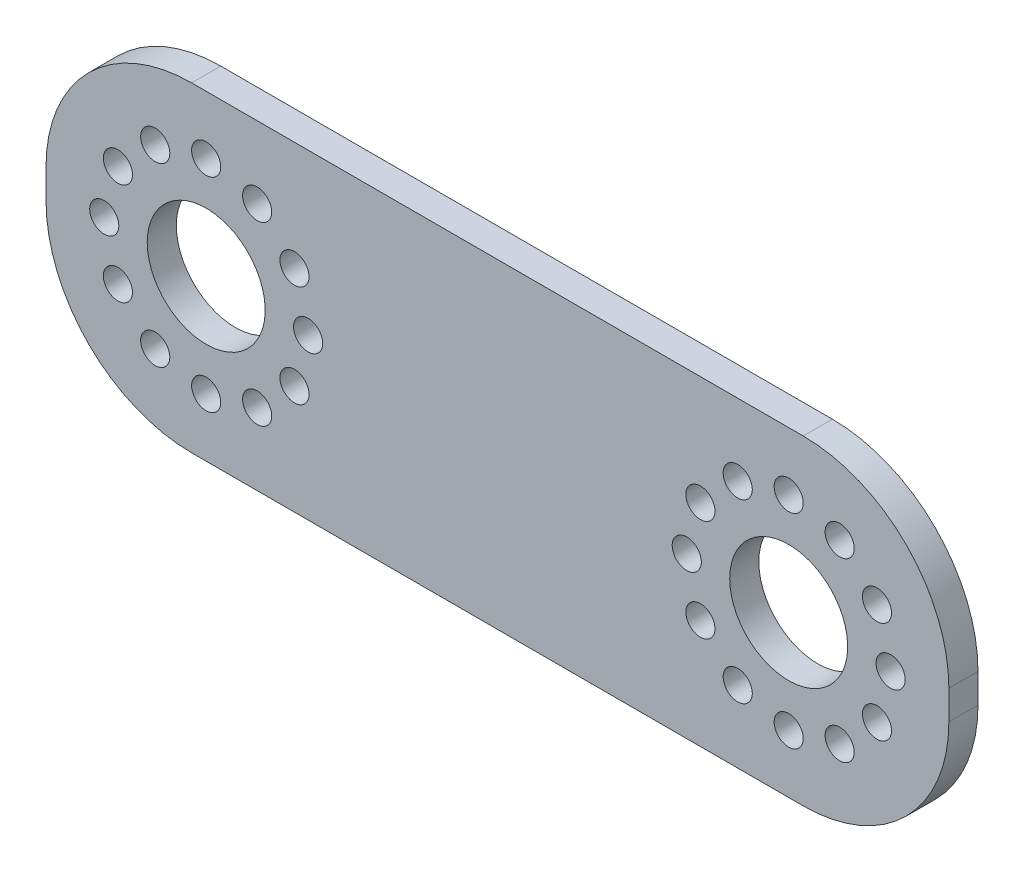
ISO-10303-21;
HEADER;
FILE_DESCRIPTION(('STEP AP214'),'2;1');
FILE_NAME('part.step','',(''),(''),'','','');
FILE_SCHEMA(('AUTOMOTIVE_DESIGN { 1 0 10303 214 1 1 1 1 }'));
ENDSEC;
DATA;
#1=APPLICATION_CONTEXT('core data for automotive mechanical design processes');
#2=APPLICATION_PROTOCOL_DEFINITION('international standard','automotive_design',2000,#1);
#3=PRODUCT_CONTEXT('',#1,'mechanical');
#4=PRODUCT('Part','Part','',(#3));
#5=PRODUCT_RELATED_PRODUCT_CATEGORY('part','',(#4));
#6=PRODUCT_DEFINITION_FORMATION('','',#4);
#7=PRODUCT_DEFINITION_CONTEXT('part definition',#1,'design');
#8=PRODUCT_DEFINITION('design','',#6,#7);
#9=PRODUCT_DEFINITION_SHAPE('','',#8);
#10=(LENGTH_UNIT() NAMED_UNIT(*) SI_UNIT(.MILLI.,.METRE.));
#11=(NAMED_UNIT(*) PLANE_ANGLE_UNIT() SI_UNIT($,.RADIAN.));
#12=(NAMED_UNIT(*) SI_UNIT($,.STERADIAN.) SOLID_ANGLE_UNIT());
#13=UNCERTAINTY_MEASURE_WITH_UNIT(LENGTH_MEASURE(1.E-05),#10,'distance_accuracy_value','');
#14=(GEOMETRIC_REPRESENTATION_CONTEXT(3) GLOBAL_UNCERTAINTY_ASSIGNED_CONTEXT((#13)) GLOBAL_UNIT_ASSIGNED_CONTEXT((#10,
#11,#12)) REPRESENTATION_CONTEXT('',''));
#15=CARTESIAN_POINT('',(0.,0.,0.));
#16=DIRECTION('',(0.,0.,1.));
#17=DIRECTION('',(1.,0.,0.));
#18=AXIS2_PLACEMENT_3D('',#15,#16,#17);
#19=CARTESIAN_POINT('',(62.,11.,2.));
#20=DIRECTION('',(1.,0.,0.));
#21=DIRECTION('',(0.,0.,-1.));
#22=AXIS2_PLACEMENT_3D('',#19,#20,#21);
#23=PLANE('',#22);
#24=DIRECTION('',(0.,-1.,0.));
#25=VECTOR('',#24,1.);
#26=CARTESIAN_POINT('',(62.,11.,0.));
#27=LINE('',#26,#25);
#28=CARTESIAN_POINT('',(62.,0.999999999999999,0.));
#29=VERTEX_POINT('',#28);
#30=CARTESIAN_POINT('',(62.,-0.999999999999999,0.));
#31=VERTEX_POINT('',#30);
#32=EDGE_CURVE('E157',#29,#31,#27,.T.);
#33=ORIENTED_EDGE('',*,*,#32,.F.);
#34=DIRECTION('',(0.,0.,-1.));
#35=VECTOR('',#34,1.);
#36=CARTESIAN_POINT('',(62.,0.999999999999999,2.));
#37=LINE('',#36,#35);
#38=CARTESIAN_POINT('',(62.,0.999999999999999,2.));
#39=VERTEX_POINT('',#38);
#40=EDGE_CURVE('E137',#29,#39,#37,.F.);
#41=ORIENTED_EDGE('',*,*,#40,.T.);
#42=DIRECTION('',(0.,-1.,0.));
#43=VECTOR('',#42,1.);
#44=CARTESIAN_POINT('',(62.,11.,2.));
#45=LINE('',#44,#43);
#46=CARTESIAN_POINT('',(62.,-0.999999999999999,2.));
#47=VERTEX_POINT('',#46);
#48=EDGE_CURVE('E118',#39,#47,#45,.T.);
#49=ORIENTED_EDGE('',*,*,#48,.T.);
#50=DIRECTION('',(0.,0.,-1.));
#51=VECTOR('',#50,1.);
#52=CARTESIAN_POINT('',(62.,-0.999999999999999,2.));
#53=LINE('',#52,#51);
#54=EDGE_CURVE('E134',#47,#31,#53,.T.);
#55=ORIENTED_EDGE('',*,*,#54,.T.);
#56=EDGE_LOOP('',(#33,#41,#49,#55));
#57=FACE_BOUND('',#56,.T.);
#58=ADVANCED_FACE('F32',(#57),#23,.T.);
#59=CARTESIAN_POINT('',(0.,11.,2.));
#60=DIRECTION('',(0.,1.,0.));
#61=DIRECTION('',(-1.,0.,0.));
#62=AXIS2_PLACEMENT_3D('',#59,#60,#61);
#63=PLANE('',#62);
#64=DIRECTION('',(1.,0.,0.));
#65=VECTOR('',#64,1.);
#66=CARTESIAN_POINT('',(0.,11.,2.));
#67=LINE('',#66,#65);
#68=CARTESIAN_POINT('',(10.,11.,2.));
#69=VERTEX_POINT('',#68);
#70=CARTESIAN_POINT('',(52.,11.,2.));
#71=VERTEX_POINT('',#70);
#72=EDGE_CURVE('E122',#69,#71,#67,.T.);
#73=ORIENTED_EDGE('',*,*,#72,.T.);
#74=DIRECTION('',(0.,0.,-1.));
#75=VECTOR('',#74,1.);
#76=CARTESIAN_POINT('',(52.,11.,2.));
#77=LINE('',#76,#75);
#78=CARTESIAN_POINT('',(52.,11.,0.));
#79=VERTEX_POINT('',#78);
#80=EDGE_CURVE('E109',#71,#79,#77,.T.);
#81=ORIENTED_EDGE('',*,*,#80,.T.);
#82=DIRECTION('',(1.,0.,0.));
#83=VECTOR('',#82,1.);
#84=CARTESIAN_POINT('',(0.,11.,0.));
#85=LINE('',#84,#83);
#86=CARTESIAN_POINT('',(10.,11.,0.));
#87=VERTEX_POINT('',#86);
#88=EDGE_CURVE('E101',#87,#79,#85,.T.);
#89=ORIENTED_EDGE('',*,*,#88,.F.);
#90=DIRECTION('',(0.,0.,-1.));
#91=VECTOR('',#90,1.);
#92=CARTESIAN_POINT('',(10.,11.,2.));
#93=LINE('',#92,#91);
#94=EDGE_CURVE('E115',#87,#69,#93,.F.);
#95=ORIENTED_EDGE('',*,*,#94,.T.);
#96=EDGE_LOOP('',(#73,#81,#89,#95));
#97=FACE_BOUND('',#96,.T.);
#98=ADVANCED_FACE('F114',(#97),#63,.T.);
#99=CARTESIAN_POINT('',(0.,-11.,2.));
#100=DIRECTION('',(-1.,0.,0.));
#101=DIRECTION('',(0.,-1.,0.));
#102=AXIS2_PLACEMENT_3D('',#99,#100,#101);
#103=PLANE('',#102);
#104=DIRECTION('',(0.,1.,0.));
#105=VECTOR('',#104,1.);
#106=CARTESIAN_POINT('',(0.,-11.,0.));
#107=LINE('',#106,#105);
#108=CARTESIAN_POINT('',(0.,-0.999999999999996,0.));
#109=VERTEX_POINT('',#108);
#110=CARTESIAN_POINT('',(0.,1.,0.));
#111=VERTEX_POINT('',#110);
#112=EDGE_CURVE('E103',#109,#111,#107,.T.);
#113=ORIENTED_EDGE('',*,*,#112,.F.);
#114=DIRECTION('',(0.,0.,-1.));
#115=VECTOR('',#114,1.);
#116=CARTESIAN_POINT('',(0.,-0.999999999999996,2.));
#117=LINE('',#116,#115);
#118=CARTESIAN_POINT('',(0.,-0.999999999999996,2.));
#119=VERTEX_POINT('',#118);
#120=EDGE_CURVE('E11',#109,#119,#117,.F.);
#121=ORIENTED_EDGE('',*,*,#120,.T.);
#122=DIRECTION('',(0.,1.,0.));
#123=VECTOR('',#122,1.);
#124=CARTESIAN_POINT('',(0.,-11.,2.));
#125=LINE('',#124,#123);
#126=CARTESIAN_POINT('',(0.,1.,2.));
#127=VERTEX_POINT('',#126);
#128=EDGE_CURVE('E125',#119,#127,#125,.T.);
#129=ORIENTED_EDGE('',*,*,#128,.T.);
#130=DIRECTION('',(0.,0.,-1.));
#131=VECTOR('',#130,1.);
#132=CARTESIAN_POINT('',(0.,1.,2.));
#133=LINE('',#132,#131);
#134=EDGE_CURVE('E40',#127,#111,#133,.T.);
#135=ORIENTED_EDGE('',*,*,#134,.T.);
#136=EDGE_LOOP('',(#113,#121,#129,#135));
#137=FACE_BOUND('',#136,.T.);
#138=ADVANCED_FACE('F150',(#137),#103,.T.);
#139=CARTESIAN_POINT('',(62.,-11.,2.));
#140=DIRECTION('',(0.,-1.,0.));
#141=DIRECTION('',(1.,0.,0.));
#142=AXIS2_PLACEMENT_3D('',#139,#140,#141);
#143=PLANE('',#142);
#144=DIRECTION('',(-1.,0.,0.));
#145=VECTOR('',#144,1.);
#146=CARTESIAN_POINT('',(62.,-11.,0.));
#147=LINE('',#146,#145);
#148=CARTESIAN_POINT('',(52.,-11.,0.));
#149=VERTEX_POINT('',#148);
#150=CARTESIAN_POINT('',(10.,-11.,0.));
#151=VERTEX_POINT('',#150);
#152=EDGE_CURVE('E160',#149,#151,#147,.T.);
#153=ORIENTED_EDGE('',*,*,#152,.F.);
#154=DIRECTION('',(0.,0.,-1.));
#155=VECTOR('',#154,1.);
#156=CARTESIAN_POINT('',(52.,-11.,2.));
#157=LINE('',#156,#155);
#158=CARTESIAN_POINT('',(52.,-11.,2.));
#159=VERTEX_POINT('',#158);
#160=EDGE_CURVE('E54',#149,#159,#157,.F.);
#161=ORIENTED_EDGE('',*,*,#160,.T.);
#162=DIRECTION('',(-1.,0.,0.));
#163=VECTOR('',#162,1.);
#164=CARTESIAN_POINT('',(62.,-11.,2.));
#165=LINE('',#164,#163);
#166=CARTESIAN_POINT('',(10.,-11.,2.));
#167=VERTEX_POINT('',#166);
#168=EDGE_CURVE('E152',#159,#167,#165,.T.);
#169=ORIENTED_EDGE('',*,*,#168,.T.);
#170=DIRECTION('',(0.,0.,-1.));
#171=VECTOR('',#170,1.);
#172=CARTESIAN_POINT('',(10.,-11.,2.));
#173=LINE('',#172,#171);
#174=EDGE_CURVE('E145',#167,#151,#173,.T.);
#175=ORIENTED_EDGE('',*,*,#174,.T.);
#176=EDGE_LOOP('',(#153,#161,#169,#175));
#177=FACE_BOUND('',#176,.T.);
#178=ADVANCED_FACE('F163',(#177),#143,.T.);
#179=CARTESIAN_POINT('',(0.,0.,2.));
#180=DIRECTION('',(0.,0.,-1.));
#181=DIRECTION('',(-1.,0.,0.));
#182=AXIS2_PLACEMENT_3D('',#179,#180,#181);
#183=PLANE('',#182);
#184=CARTESIAN_POINT('',(44.9378221735089,3.5,2.));
#185=DIRECTION('',(0.,0.,-1.));
#186=DIRECTION('',(-1.,0.,0.));
#187=AXIS2_PLACEMENT_3D('',#184,#185,#186);
#188=CIRCLE('',#187,1.);
#189=CARTESIAN_POINT('',(43.9378221735089,3.5,2.));
#190=VERTEX_POINT('',#189);
#191=EDGE_CURVE('E324',#190,#190,#188,.T.);
#192=ORIENTED_EDGE('',*,*,#191,.T.);
#193=EDGE_LOOP('',(#192));
#194=FACE_BOUND('',#193,.T.);
#195=CARTESIAN_POINT('',(47.5,6.06217782649107,2.));
#196=DIRECTION('',(0.,0.,-1.));
#197=DIRECTION('',(-1.,0.,0.));
#198=AXIS2_PLACEMENT_3D('',#195,#196,#197);
#199=CIRCLE('',#198,0.999999999999998);
#200=CARTESIAN_POINT('',(46.5,6.06217782649107,2.));
#201=VERTEX_POINT('',#200);
#202=EDGE_CURVE('E318',#201,#201,#199,.T.);
#203=ORIENTED_EDGE('',*,*,#202,.T.);
#204=EDGE_LOOP('',(#203));
#205=FACE_BOUND('',#204,.T.);
#206=CARTESIAN_POINT('',(51.,7.,2.));
#207=DIRECTION('',(0.,0.,-1.));
#208=DIRECTION('',(-1.,0.,0.));
#209=AXIS2_PLACEMENT_3D('',#206,#207,#208);
#210=CIRCLE('',#209,0.999999999999998);
#211=CARTESIAN_POINT('',(50.,7.,2.));
#212=VERTEX_POINT('',#211);
#213=EDGE_CURVE('E312',#212,#212,#210,.T.);
#214=ORIENTED_EDGE('',*,*,#213,.T.);
#215=EDGE_LOOP('',(#214));
#216=FACE_BOUND('',#215,.T.);
#217=CARTESIAN_POINT('',(54.5,6.06217782649107,2.));
#218=DIRECTION('',(0.,0.,-1.));
#219=DIRECTION('',(-1.,0.,0.));
#220=AXIS2_PLACEMENT_3D('',#217,#218,#219);
#221=CIRCLE('',#220,0.999999999999998);
#222=CARTESIAN_POINT('',(53.5,6.06217782649107,2.));
#223=VERTEX_POINT('',#222);
#224=EDGE_CURVE('E306',#223,#223,#221,.T.);
#225=ORIENTED_EDGE('',*,*,#224,.T.);
#226=EDGE_LOOP('',(#225));
#227=FACE_BOUND('',#226,.T.);
#228=CARTESIAN_POINT('',(57.0621778264911,3.5,2.));
#229=DIRECTION('',(0.,0.,-1.));
#230=DIRECTION('',(-1.,0.,0.));
#231=AXIS2_PLACEMENT_3D('',#228,#229,#230);
#232=CIRCLE('',#231,0.999999999999998);
#233=CARTESIAN_POINT('',(56.0621778264911,3.5,2.));
#234=VERTEX_POINT('',#233);
#235=EDGE_CURVE('E300',#234,#234,#232,.T.);
#236=ORIENTED_EDGE('',*,*,#235,.T.);
#237=EDGE_LOOP('',(#236));
#238=FACE_BOUND('',#237,.T.);
#239=CARTESIAN_POINT('',(58.,0.,2.));
#240=DIRECTION('',(0.,0.,-1.));
#241=DIRECTION('',(-1.,0.,0.));
#242=AXIS2_PLACEMENT_3D('',#239,#240,#241);
#243=CIRCLE('',#242,0.999999999999998);
#244=CARTESIAN_POINT('',(57.,0.,2.));
#245=VERTEX_POINT('',#244);
#246=EDGE_CURVE('E294',#245,#245,#243,.T.);
#247=ORIENTED_EDGE('',*,*,#246,.T.);
#248=EDGE_LOOP('',(#247));
#249=FACE_BOUND('',#248,.T.);
#250=CARTESIAN_POINT('',(57.0621778264911,-3.5,2.));
#251=DIRECTION('',(0.,0.,-1.));
#252=DIRECTION('',(-1.,0.,0.));
#253=AXIS2_PLACEMENT_3D('',#250,#251,#252);
#254=CIRCLE('',#253,1.);
#255=CARTESIAN_POINT('',(56.0621778264911,-3.5,2.));
#256=VERTEX_POINT('',#255);
#257=EDGE_CURVE('E288',#256,#256,#254,.T.);
#258=ORIENTED_EDGE('',*,*,#257,.T.);
#259=EDGE_LOOP('',(#258));
#260=FACE_BOUND('',#259,.T.);
#261=CARTESIAN_POINT('',(54.5,-6.06217782649107,2.));
#262=DIRECTION('',(0.,0.,-1.));
#263=DIRECTION('',(-1.,0.,0.));
#264=AXIS2_PLACEMENT_3D('',#261,#262,#263);
#265=CIRCLE('',#264,0.999999999999998);
#266=CARTESIAN_POINT('',(53.5,-6.06217782649107,2.));
#267=VERTEX_POINT('',#266);
#268=EDGE_CURVE('E282',#267,#267,#265,.T.);
#269=ORIENTED_EDGE('',*,*,#268,.T.);
#270=EDGE_LOOP('',(#269));
#271=FACE_BOUND('',#270,.T.);
#272=CARTESIAN_POINT('',(51.,-7.,2.));
#273=DIRECTION('',(0.,0.,-1.));
#274=DIRECTION('',(-1.,0.,0.));
#275=AXIS2_PLACEMENT_3D('',#272,#273,#274);
#276=CIRCLE('',#275,1.00000000000001);
#277=CARTESIAN_POINT('',(50.,-7.,2.));
#278=VERTEX_POINT('',#277);
#279=EDGE_CURVE('E276',#278,#278,#276,.T.);
#280=ORIENTED_EDGE('',*,*,#279,.T.);
#281=EDGE_LOOP('',(#280));
#282=FACE_BOUND('',#281,.T.);
#283=CARTESIAN_POINT('',(47.5,-6.06217782649107,2.));
#284=DIRECTION('',(0.,0.,-1.));
#285=DIRECTION('',(-1.,0.,0.));
#286=AXIS2_PLACEMENT_3D('',#283,#284,#285);
#287=CIRCLE('',#286,0.999999999999998);
#288=CARTESIAN_POINT('',(46.5,-6.06217782649107,2.));
#289=VERTEX_POINT('',#288);
#290=EDGE_CURVE('E270',#289,#289,#287,.T.);
#291=ORIENTED_EDGE('',*,*,#290,.T.);
#292=EDGE_LOOP('',(#291));
#293=FACE_BOUND('',#292,.T.);
#294=CARTESIAN_POINT('',(44.9378221735089,-3.5,2.));
#295=DIRECTION('',(0.,0.,-1.));
#296=DIRECTION('',(-1.,0.,0.));
#297=AXIS2_PLACEMENT_3D('',#294,#295,#296);
#298=CIRCLE('',#297,0.999999999999998);
#299=CARTESIAN_POINT('',(43.9378221735089,-3.5,2.));
#300=VERTEX_POINT('',#299);
#301=EDGE_CURVE('E264',#300,#300,#298,.T.);
#302=ORIENTED_EDGE('',*,*,#301,.T.);
#303=EDGE_LOOP('',(#302));
#304=FACE_BOUND('',#303,.T.);
#305=CARTESIAN_POINT('',(44.,0.,2.));
#306=DIRECTION('',(0.,0.,-1.));
#307=DIRECTION('',(-1.,0.,0.));
#308=AXIS2_PLACEMENT_3D('',#305,#306,#307);
#309=CIRCLE('',#308,1.);
#310=CARTESIAN_POINT('',(43.,0.,2.));
#311=VERTEX_POINT('',#310);
#312=EDGE_CURVE('E258',#311,#311,#309,.T.);
#313=ORIENTED_EDGE('',*,*,#312,.T.);
#314=EDGE_LOOP('',(#313));
#315=FACE_BOUND('',#314,.T.);
#316=CARTESIAN_POINT('',(51.,0.,2.));
#317=DIRECTION('',(0.,0.,-1.));
#318=DIRECTION('',(-1.,0.,0.));
#319=AXIS2_PLACEMENT_3D('',#316,#317,#318);
#320=CIRCLE('',#319,4.05);
#321=CARTESIAN_POINT('',(46.95,0.,2.));
#322=VERTEX_POINT('',#321);
#323=EDGE_CURVE('E252',#322,#322,#320,.T.);
#324=ORIENTED_EDGE('',*,*,#323,.T.);
#325=EDGE_LOOP('',(#324));
#326=FACE_BOUND('',#325,.T.);
#327=CARTESIAN_POINT('',(4.93782217350893,3.5,2.));
#328=DIRECTION('',(0.,0.,-1.));
#329=DIRECTION('',(-1.,0.,0.));
#330=AXIS2_PLACEMENT_3D('',#327,#328,#329);
#331=CIRCLE('',#330,1.);
#332=CARTESIAN_POINT('',(3.93782217350893,3.5,2.));
#333=VERTEX_POINT('',#332);
#334=EDGE_CURVE('E246',#333,#333,#331,.T.);
#335=ORIENTED_EDGE('',*,*,#334,.T.);
#336=EDGE_LOOP('',(#335));
#337=FACE_BOUND('',#336,.T.);
#338=CARTESIAN_POINT('',(7.5,6.06217782649107,2.));
#339=DIRECTION('',(0.,0.,-1.));
#340=DIRECTION('',(-1.,0.,0.));
#341=AXIS2_PLACEMENT_3D('',#338,#339,#340);
#342=CIRCLE('',#341,1.);
#343=CARTESIAN_POINT('',(6.5,6.06217782649107,2.));
#344=VERTEX_POINT('',#343);
#345=EDGE_CURVE('E240',#344,#344,#342,.T.);
#346=ORIENTED_EDGE('',*,*,#345,.T.);
#347=EDGE_LOOP('',(#346));
#348=FACE_BOUND('',#347,.T.);
#349=CARTESIAN_POINT('',(11.,7.,2.));
#350=DIRECTION('',(0.,0.,-1.));
#351=DIRECTION('',(-1.,0.,0.));
#352=AXIS2_PLACEMENT_3D('',#349,#350,#351);
#353=CIRCLE('',#352,1.);
#354=CARTESIAN_POINT('',(10.,7.,2.));
#355=VERTEX_POINT('',#354);
#356=EDGE_CURVE('E234',#355,#355,#353,.T.);
#357=ORIENTED_EDGE('',*,*,#356,.T.);
#358=EDGE_LOOP('',(#357));
#359=FACE_BOUND('',#358,.T.);
#360=CARTESIAN_POINT('',(14.5,6.06217782649107,2.));
#361=DIRECTION('',(0.,0.,-1.));
#362=DIRECTION('',(-1.,0.,0.));
#363=AXIS2_PLACEMENT_3D('',#360,#361,#362);
#364=CIRCLE('',#363,1.);
#365=CARTESIAN_POINT('',(13.5,6.06217782649107,2.));
#366=VERTEX_POINT('',#365);
#367=EDGE_CURVE('E228',#366,#366,#364,.T.);
#368=ORIENTED_EDGE('',*,*,#367,.T.);
#369=EDGE_LOOP('',(#368));
#370=FACE_BOUND('',#369,.T.);
#371=CARTESIAN_POINT('',(17.0621778264911,3.5,2.));
#372=DIRECTION('',(0.,0.,-1.));
#373=DIRECTION('',(-1.,0.,0.));
#374=AXIS2_PLACEMENT_3D('',#371,#372,#373);
#375=CIRCLE('',#374,1.);
#376=CARTESIAN_POINT('',(16.0621778264911,3.5,2.));
#377=VERTEX_POINT('',#376);
#378=EDGE_CURVE('E222',#377,#377,#375,.T.);
#379=ORIENTED_EDGE('',*,*,#378,.T.);
#380=EDGE_LOOP('',(#379));
#381=FACE_BOUND('',#380,.T.);
#382=CARTESIAN_POINT('',(18.,0.,2.));
#383=DIRECTION('',(0.,0.,-1.));
#384=DIRECTION('',(-1.,0.,0.));
#385=AXIS2_PLACEMENT_3D('',#382,#383,#384);
#386=CIRCLE('',#385,0.999999999999998);
#387=CARTESIAN_POINT('',(17.,0.,2.));
#388=VERTEX_POINT('',#387);
#389=EDGE_CURVE('E216',#388,#388,#386,.T.);
#390=ORIENTED_EDGE('',*,*,#389,.T.);
#391=EDGE_LOOP('',(#390));
#392=FACE_BOUND('',#391,.T.);
#393=CARTESIAN_POINT('',(17.0621778264911,-3.5,2.));
#394=DIRECTION('',(0.,0.,-1.));
#395=DIRECTION('',(-1.,0.,0.));
#396=AXIS2_PLACEMENT_3D('',#393,#394,#395);
#397=CIRCLE('',#396,0.999999999999998);
#398=CARTESIAN_POINT('',(16.0621778264911,-3.5,2.));
#399=VERTEX_POINT('',#398);
#400=EDGE_CURVE('E210',#399,#399,#397,.T.);
#401=ORIENTED_EDGE('',*,*,#400,.T.);
#402=EDGE_LOOP('',(#401));
#403=FACE_BOUND('',#402,.T.);
#404=CARTESIAN_POINT('',(14.5,-6.06217782649107,2.));
#405=DIRECTION('',(0.,0.,-1.));
#406=DIRECTION('',(-1.,0.,0.));
#407=AXIS2_PLACEMENT_3D('',#404,#405,#406);
#408=CIRCLE('',#407,1.);
#409=CARTESIAN_POINT('',(13.5,-6.06217782649107,2.));
#410=VERTEX_POINT('',#409);
#411=EDGE_CURVE('E204',#410,#410,#408,.T.);
#412=ORIENTED_EDGE('',*,*,#411,.T.);
#413=EDGE_LOOP('',(#412));
#414=FACE_BOUND('',#413,.T.);
#415=CARTESIAN_POINT('',(11.,-7.,2.));
#416=DIRECTION('',(0.,0.,-1.));
#417=DIRECTION('',(-1.,0.,0.));
#418=AXIS2_PLACEMENT_3D('',#415,#416,#417);
#419=CIRCLE('',#418,1.);
#420=CARTESIAN_POINT('',(10.,-7.,2.));
#421=VERTEX_POINT('',#420);
#422=EDGE_CURVE('E198',#421,#421,#419,.T.);
#423=ORIENTED_EDGE('',*,*,#422,.T.);
#424=EDGE_LOOP('',(#423));
#425=FACE_BOUND('',#424,.T.);
#426=CARTESIAN_POINT('',(7.5,-6.06217782649107,2.));
#427=DIRECTION('',(0.,0.,-1.));
#428=DIRECTION('',(-1.,0.,0.));
#429=AXIS2_PLACEMENT_3D('',#426,#427,#428);
#430=CIRCLE('',#429,1.);
#431=CARTESIAN_POINT('',(6.5,-6.06217782649107,2.));
#432=VERTEX_POINT('',#431);
#433=EDGE_CURVE('E192',#432,#432,#430,.T.);
#434=ORIENTED_EDGE('',*,*,#433,.T.);
#435=EDGE_LOOP('',(#434));
#436=FACE_BOUND('',#435,.T.);
#437=CARTESIAN_POINT('',(4.93782217350893,-3.5,2.));
#438=DIRECTION('',(0.,0.,-1.));
#439=DIRECTION('',(-1.,0.,0.));
#440=AXIS2_PLACEMENT_3D('',#437,#438,#439);
#441=CIRCLE('',#440,1.);
#442=CARTESIAN_POINT('',(3.93782217350893,-3.5,2.));
#443=VERTEX_POINT('',#442);
#444=EDGE_CURVE('E186',#443,#443,#441,.T.);
#445=ORIENTED_EDGE('',*,*,#444,.T.);
#446=EDGE_LOOP('',(#445));
#447=FACE_BOUND('',#446,.T.);
#448=CARTESIAN_POINT('',(4.,0.,2.));
#449=DIRECTION('',(0.,0.,-1.));
#450=DIRECTION('',(-1.,0.,0.));
#451=AXIS2_PLACEMENT_3D('',#448,#449,#450);
#452=CIRCLE('',#451,1.);
#453=CARTESIAN_POINT('',(3.,0.,2.));
#454=VERTEX_POINT('',#453);
#455=EDGE_CURVE('E180',#454,#454,#452,.T.);
#456=ORIENTED_EDGE('',*,*,#455,.T.);
#457=EDGE_LOOP('',(#456));
#458=FACE_BOUND('',#457,.T.);
#459=CARTESIAN_POINT('',(11.,0.,2.));
#460=DIRECTION('',(0.,0.,-1.));
#461=DIRECTION('',(-1.,0.,0.));
#462=AXIS2_PLACEMENT_3D('',#459,#460,#461);
#463=CIRCLE('',#462,4.05);
#464=CARTESIAN_POINT('',(6.95,0.,2.));
#465=VERTEX_POINT('',#464);
#466=EDGE_CURVE('E161',#465,#465,#463,.T.);
#467=ORIENTED_EDGE('',*,*,#466,.T.);
#468=EDGE_LOOP('',(#467));
#469=FACE_BOUND('',#468,.T.);
#470=ORIENTED_EDGE('',*,*,#48,.F.);
#471=CARTESIAN_POINT('',(52.,0.999999999999999,2.));
#472=DIRECTION('',(0.,0.,-1.));
#473=DIRECTION('',(-1.,0.,0.));
#474=AXIS2_PLACEMENT_3D('',#471,#472,#473);
#475=CIRCLE('',#474,10.);
#476=EDGE_CURVE('E143',#39,#71,#475,.F.);
#477=ORIENTED_EDGE('',*,*,#476,.T.);
#478=ORIENTED_EDGE('',*,*,#72,.F.);
#479=CARTESIAN_POINT('',(10.,1.,2.));
#480=DIRECTION('',(0.,0.,-1.));
#481=DIRECTION('',(-1.,0.,0.));
#482=AXIS2_PLACEMENT_3D('',#479,#480,#481);
#483=CIRCLE('',#482,10.);
#484=EDGE_CURVE('E121',#69,#127,#483,.F.);
#485=ORIENTED_EDGE('',*,*,#484,.T.);
#486=ORIENTED_EDGE('',*,*,#128,.F.);
#487=CARTESIAN_POINT('',(10.,-0.999999999999998,2.));
#488=DIRECTION('',(0.,0.,-1.));
#489=DIRECTION('',(-1.,0.,0.));
#490=AXIS2_PLACEMENT_3D('',#487,#488,#489);
#491=CIRCLE('',#490,10.);
#492=EDGE_CURVE('E47',#119,#167,#491,.F.);
#493=ORIENTED_EDGE('',*,*,#492,.T.);
#494=ORIENTED_EDGE('',*,*,#168,.F.);
#495=CARTESIAN_POINT('',(52.,-0.999999999999999,2.));
#496=DIRECTION('',(0.,0.,-1.));
#497=DIRECTION('',(-1.,0.,0.));
#498=AXIS2_PLACEMENT_3D('',#495,#496,#497);
#499=CIRCLE('',#498,10.);
#500=EDGE_CURVE('E141',#159,#47,#499,.F.);
#501=ORIENTED_EDGE('',*,*,#500,.T.);
#502=EDGE_LOOP('',(#470,#477,#478,#485,#486,#493,#494,#501));
#503=FACE_BOUND('',#502,.T.);
#504=ADVANCED_FACE('F171',(#194,#205,#216,#227,#238,#249,#260,#271,#282,#293,#304,#315,#326,
#337,#348,#359,#370,#381,#392,#403,#414,#425,#436,#447,#458,#469,#503),#183,.F.);
#505=CARTESIAN_POINT('',(0.,0.,0.));
#506=DIRECTION('',(0.,0.,-1.));
#507=DIRECTION('',(-1.,0.,0.));
#508=AXIS2_PLACEMENT_3D('',#505,#506,#507);
#509=PLANE('',#508);
#510=CARTESIAN_POINT('',(44.9378221735089,3.5,0.));
#511=DIRECTION('',(0.,0.,-1.));
#512=DIRECTION('',(-1.,0.,0.));
#513=AXIS2_PLACEMENT_3D('',#510,#511,#512);
#514=CIRCLE('',#513,1.);
#515=CARTESIAN_POINT('',(43.9378221735089,3.5,0.));
#516=VERTEX_POINT('',#515);
#517=EDGE_CURVE('E327',#516,#516,#514,.T.);
#518=ORIENTED_EDGE('',*,*,#517,.F.);
#519=EDGE_LOOP('',(#518));
#520=FACE_BOUND('',#519,.T.);
#521=CARTESIAN_POINT('',(47.5,6.06217782649107,0.));
#522=DIRECTION('',(0.,0.,-1.));
#523=DIRECTION('',(-1.,0.,0.));
#524=AXIS2_PLACEMENT_3D('',#521,#522,#523);
#525=CIRCLE('',#524,0.999999999999998);
#526=CARTESIAN_POINT('',(46.5,6.06217782649107,0.));
#527=VERTEX_POINT('',#526);
#528=EDGE_CURVE('E321',#527,#527,#525,.T.);
#529=ORIENTED_EDGE('',*,*,#528,.F.);
#530=EDGE_LOOP('',(#529));
#531=FACE_BOUND('',#530,.T.);
#532=CARTESIAN_POINT('',(51.,7.,0.));
#533=DIRECTION('',(0.,0.,-1.));
#534=DIRECTION('',(-1.,0.,0.));
#535=AXIS2_PLACEMENT_3D('',#532,#533,#534);
#536=CIRCLE('',#535,0.999999999999998);
#537=CARTESIAN_POINT('',(50.,7.,0.));
#538=VERTEX_POINT('',#537);
#539=EDGE_CURVE('E315',#538,#538,#536,.T.);
#540=ORIENTED_EDGE('',*,*,#539,.F.);
#541=EDGE_LOOP('',(#540));
#542=FACE_BOUND('',#541,.T.);
#543=CARTESIAN_POINT('',(54.5,6.06217782649107,0.));
#544=DIRECTION('',(0.,0.,-1.));
#545=DIRECTION('',(-1.,0.,0.));
#546=AXIS2_PLACEMENT_3D('',#543,#544,#545);
#547=CIRCLE('',#546,0.999999999999998);
#548=CARTESIAN_POINT('',(53.5,6.06217782649107,0.));
#549=VERTEX_POINT('',#548);
#550=EDGE_CURVE('E309',#549,#549,#547,.T.);
#551=ORIENTED_EDGE('',*,*,#550,.F.);
#552=EDGE_LOOP('',(#551));
#553=FACE_BOUND('',#552,.T.);
#554=CARTESIAN_POINT('',(57.0621778264911,3.5,0.));
#555=DIRECTION('',(0.,0.,-1.));
#556=DIRECTION('',(-1.,0.,0.));
#557=AXIS2_PLACEMENT_3D('',#554,#555,#556);
#558=CIRCLE('',#557,0.999999999999998);
#559=CARTESIAN_POINT('',(56.0621778264911,3.5,0.));
#560=VERTEX_POINT('',#559);
#561=EDGE_CURVE('E303',#560,#560,#558,.T.);
#562=ORIENTED_EDGE('',*,*,#561,.F.);
#563=EDGE_LOOP('',(#562));
#564=FACE_BOUND('',#563,.T.);
#565=CARTESIAN_POINT('',(58.,0.,0.));
#566=DIRECTION('',(0.,0.,-1.));
#567=DIRECTION('',(-1.,0.,0.));
#568=AXIS2_PLACEMENT_3D('',#565,#566,#567);
#569=CIRCLE('',#568,0.999999999999998);
#570=CARTESIAN_POINT('',(57.,0.,0.));
#571=VERTEX_POINT('',#570);
#572=EDGE_CURVE('E297',#571,#571,#569,.T.);
#573=ORIENTED_EDGE('',*,*,#572,.F.);
#574=EDGE_LOOP('',(#573));
#575=FACE_BOUND('',#574,.T.);
#576=CARTESIAN_POINT('',(57.0621778264911,-3.5,0.));
#577=DIRECTION('',(0.,0.,-1.));
#578=DIRECTION('',(-1.,0.,0.));
#579=AXIS2_PLACEMENT_3D('',#576,#577,#578);
#580=CIRCLE('',#579,1.);
#581=CARTESIAN_POINT('',(56.0621778264911,-3.5,0.));
#582=VERTEX_POINT('',#581);
#583=EDGE_CURVE('E291',#582,#582,#580,.T.);
#584=ORIENTED_EDGE('',*,*,#583,.F.);
#585=EDGE_LOOP('',(#584));
#586=FACE_BOUND('',#585,.T.);
#587=CARTESIAN_POINT('',(54.5,-6.06217782649107,0.));
#588=DIRECTION('',(0.,0.,-1.));
#589=DIRECTION('',(-1.,0.,0.));
#590=AXIS2_PLACEMENT_3D('',#587,#588,#589);
#591=CIRCLE('',#590,0.999999999999998);
#592=CARTESIAN_POINT('',(53.5,-6.06217782649107,0.));
#593=VERTEX_POINT('',#592);
#594=EDGE_CURVE('E285',#593,#593,#591,.T.);
#595=ORIENTED_EDGE('',*,*,#594,.F.);
#596=EDGE_LOOP('',(#595));
#597=FACE_BOUND('',#596,.T.);
#598=CARTESIAN_POINT('',(51.,-7.,0.));
#599=DIRECTION('',(0.,0.,-1.));
#600=DIRECTION('',(-1.,0.,0.));
#601=AXIS2_PLACEMENT_3D('',#598,#599,#600);
#602=CIRCLE('',#601,1.00000000000001);
#603=CARTESIAN_POINT('',(50.,-7.,0.));
#604=VERTEX_POINT('',#603);
#605=EDGE_CURVE('E279',#604,#604,#602,.T.);
#606=ORIENTED_EDGE('',*,*,#605,.F.);
#607=EDGE_LOOP('',(#606));
#608=FACE_BOUND('',#607,.T.);
#609=CARTESIAN_POINT('',(47.5,-6.06217782649107,0.));
#610=DIRECTION('',(0.,0.,-1.));
#611=DIRECTION('',(-1.,0.,0.));
#612=AXIS2_PLACEMENT_3D('',#609,#610,#611);
#613=CIRCLE('',#612,0.999999999999998);
#614=CARTESIAN_POINT('',(46.5,-6.06217782649107,0.));
#615=VERTEX_POINT('',#614);
#616=EDGE_CURVE('E273',#615,#615,#613,.T.);
#617=ORIENTED_EDGE('',*,*,#616,.F.);
#618=EDGE_LOOP('',(#617));
#619=FACE_BOUND('',#618,.T.);
#620=CARTESIAN_POINT('',(44.9378221735089,-3.5,0.));
#621=DIRECTION('',(0.,0.,-1.));
#622=DIRECTION('',(-1.,0.,0.));
#623=AXIS2_PLACEMENT_3D('',#620,#621,#622);
#624=CIRCLE('',#623,0.999999999999998);
#625=CARTESIAN_POINT('',(43.9378221735089,-3.5,0.));
#626=VERTEX_POINT('',#625);
#627=EDGE_CURVE('E267',#626,#626,#624,.T.);
#628=ORIENTED_EDGE('',*,*,#627,.F.);
#629=EDGE_LOOP('',(#628));
#630=FACE_BOUND('',#629,.T.);
#631=CARTESIAN_POINT('',(44.,0.,0.));
#632=DIRECTION('',(0.,0.,-1.));
#633=DIRECTION('',(-1.,0.,0.));
#634=AXIS2_PLACEMENT_3D('',#631,#632,#633);
#635=CIRCLE('',#634,1.);
#636=CARTESIAN_POINT('',(43.,0.,0.));
#637=VERTEX_POINT('',#636);
#638=EDGE_CURVE('E261',#637,#637,#635,.T.);
#639=ORIENTED_EDGE('',*,*,#638,.F.);
#640=EDGE_LOOP('',(#639));
#641=FACE_BOUND('',#640,.T.);
#642=CARTESIAN_POINT('',(51.,0.,0.));
#643=DIRECTION('',(0.,0.,-1.));
#644=DIRECTION('',(-1.,0.,0.));
#645=AXIS2_PLACEMENT_3D('',#642,#643,#644);
#646=CIRCLE('',#645,4.05);
#647=CARTESIAN_POINT('',(46.95,0.,0.));
#648=VERTEX_POINT('',#647);
#649=EDGE_CURVE('E255',#648,#648,#646,.T.);
#650=ORIENTED_EDGE('',*,*,#649,.F.);
#651=EDGE_LOOP('',(#650));
#652=FACE_BOUND('',#651,.T.);
#653=CARTESIAN_POINT('',(4.93782217350893,3.5,0.));
#654=DIRECTION('',(0.,0.,-1.));
#655=DIRECTION('',(-1.,0.,0.));
#656=AXIS2_PLACEMENT_3D('',#653,#654,#655);
#657=CIRCLE('',#656,1.);
#658=CARTESIAN_POINT('',(3.93782217350893,3.5,0.));
#659=VERTEX_POINT('',#658);
#660=EDGE_CURVE('E249',#659,#659,#657,.T.);
#661=ORIENTED_EDGE('',*,*,#660,.F.);
#662=EDGE_LOOP('',(#661));
#663=FACE_BOUND('',#662,.T.);
#664=CARTESIAN_POINT('',(7.5,6.06217782649107,0.));
#665=DIRECTION('',(0.,0.,-1.));
#666=DIRECTION('',(-1.,0.,0.));
#667=AXIS2_PLACEMENT_3D('',#664,#665,#666);
#668=CIRCLE('',#667,1.);
#669=CARTESIAN_POINT('',(6.5,6.06217782649107,0.));
#670=VERTEX_POINT('',#669);
#671=EDGE_CURVE('E243',#670,#670,#668,.T.);
#672=ORIENTED_EDGE('',*,*,#671,.F.);
#673=EDGE_LOOP('',(#672));
#674=FACE_BOUND('',#673,.T.);
#675=CARTESIAN_POINT('',(11.,7.,0.));
#676=DIRECTION('',(0.,0.,-1.));
#677=DIRECTION('',(-1.,0.,0.));
#678=AXIS2_PLACEMENT_3D('',#675,#676,#677);
#679=CIRCLE('',#678,1.);
#680=CARTESIAN_POINT('',(10.,7.,0.));
#681=VERTEX_POINT('',#680);
#682=EDGE_CURVE('E237',#681,#681,#679,.T.);
#683=ORIENTED_EDGE('',*,*,#682,.F.);
#684=EDGE_LOOP('',(#683));
#685=FACE_BOUND('',#684,.T.);
#686=CARTESIAN_POINT('',(14.5,6.06217782649107,0.));
#687=DIRECTION('',(0.,0.,-1.));
#688=DIRECTION('',(-1.,0.,0.));
#689=AXIS2_PLACEMENT_3D('',#686,#687,#688);
#690=CIRCLE('',#689,1.);
#691=CARTESIAN_POINT('',(13.5,6.06217782649107,0.));
#692=VERTEX_POINT('',#691);
#693=EDGE_CURVE('E231',#692,#692,#690,.T.);
#694=ORIENTED_EDGE('',*,*,#693,.F.);
#695=EDGE_LOOP('',(#694));
#696=FACE_BOUND('',#695,.T.);
#697=CARTESIAN_POINT('',(17.0621778264911,3.5,0.));
#698=DIRECTION('',(0.,0.,-1.));
#699=DIRECTION('',(-1.,0.,0.));
#700=AXIS2_PLACEMENT_3D('',#697,#698,#699);
#701=CIRCLE('',#700,1.);
#702=CARTESIAN_POINT('',(16.0621778264911,3.5,0.));
#703=VERTEX_POINT('',#702);
#704=EDGE_CURVE('E225',#703,#703,#701,.T.);
#705=ORIENTED_EDGE('',*,*,#704,.F.);
#706=EDGE_LOOP('',(#705));
#707=FACE_BOUND('',#706,.T.);
#708=CARTESIAN_POINT('',(18.,0.,0.));
#709=DIRECTION('',(0.,0.,-1.));
#710=DIRECTION('',(-1.,0.,0.));
#711=AXIS2_PLACEMENT_3D('',#708,#709,#710);
#712=CIRCLE('',#711,0.999999999999998);
#713=CARTESIAN_POINT('',(17.,0.,0.));
#714=VERTEX_POINT('',#713);
#715=EDGE_CURVE('E219',#714,#714,#712,.T.);
#716=ORIENTED_EDGE('',*,*,#715,.F.);
#717=EDGE_LOOP('',(#716));
#718=FACE_BOUND('',#717,.T.);
#719=CARTESIAN_POINT('',(17.0621778264911,-3.5,0.));
#720=DIRECTION('',(0.,0.,-1.));
#721=DIRECTION('',(-1.,0.,0.));
#722=AXIS2_PLACEMENT_3D('',#719,#720,#721);
#723=CIRCLE('',#722,0.999999999999998);
#724=CARTESIAN_POINT('',(16.0621778264911,-3.5,0.));
#725=VERTEX_POINT('',#724);
#726=EDGE_CURVE('E213',#725,#725,#723,.T.);
#727=ORIENTED_EDGE('',*,*,#726,.F.);
#728=EDGE_LOOP('',(#727));
#729=FACE_BOUND('',#728,.T.);
#730=CARTESIAN_POINT('',(14.5,-6.06217782649107,0.));
#731=DIRECTION('',(0.,0.,-1.));
#732=DIRECTION('',(-1.,0.,0.));
#733=AXIS2_PLACEMENT_3D('',#730,#731,#732);
#734=CIRCLE('',#733,1.);
#735=CARTESIAN_POINT('',(13.5,-6.06217782649107,0.));
#736=VERTEX_POINT('',#735);
#737=EDGE_CURVE('E207',#736,#736,#734,.T.);
#738=ORIENTED_EDGE('',*,*,#737,.F.);
#739=EDGE_LOOP('',(#738));
#740=FACE_BOUND('',#739,.T.);
#741=CARTESIAN_POINT('',(11.,-7.,0.));
#742=DIRECTION('',(0.,0.,-1.));
#743=DIRECTION('',(-1.,0.,0.));
#744=AXIS2_PLACEMENT_3D('',#741,#742,#743);
#745=CIRCLE('',#744,1.);
#746=CARTESIAN_POINT('',(10.,-7.,0.));
#747=VERTEX_POINT('',#746);
#748=EDGE_CURVE('E201',#747,#747,#745,.T.);
#749=ORIENTED_EDGE('',*,*,#748,.F.);
#750=EDGE_LOOP('',(#749));
#751=FACE_BOUND('',#750,.T.);
#752=CARTESIAN_POINT('',(7.5,-6.06217782649107,0.));
#753=DIRECTION('',(0.,0.,-1.));
#754=DIRECTION('',(-1.,0.,0.));
#755=AXIS2_PLACEMENT_3D('',#752,#753,#754);
#756=CIRCLE('',#755,1.);
#757=CARTESIAN_POINT('',(6.5,-6.06217782649107,0.));
#758=VERTEX_POINT('',#757);
#759=EDGE_CURVE('E195',#758,#758,#756,.T.);
#760=ORIENTED_EDGE('',*,*,#759,.F.);
#761=EDGE_LOOP('',(#760));
#762=FACE_BOUND('',#761,.T.);
#763=CARTESIAN_POINT('',(4.93782217350893,-3.5,0.));
#764=DIRECTION('',(0.,0.,-1.));
#765=DIRECTION('',(-1.,0.,0.));
#766=AXIS2_PLACEMENT_3D('',#763,#764,#765);
#767=CIRCLE('',#766,1.);
#768=CARTESIAN_POINT('',(3.93782217350893,-3.5,0.));
#769=VERTEX_POINT('',#768);
#770=EDGE_CURVE('E189',#769,#769,#767,.T.);
#771=ORIENTED_EDGE('',*,*,#770,.F.);
#772=EDGE_LOOP('',(#771));
#773=FACE_BOUND('',#772,.T.);
#774=CARTESIAN_POINT('',(4.,0.,0.));
#775=DIRECTION('',(0.,0.,-1.));
#776=DIRECTION('',(-1.,0.,0.));
#777=AXIS2_PLACEMENT_3D('',#774,#775,#776);
#778=CIRCLE('',#777,1.);
#779=CARTESIAN_POINT('',(3.,0.,0.));
#780=VERTEX_POINT('',#779);
#781=EDGE_CURVE('E183',#780,#780,#778,.T.);
#782=ORIENTED_EDGE('',*,*,#781,.F.);
#783=EDGE_LOOP('',(#782));
#784=FACE_BOUND('',#783,.T.);
#785=CARTESIAN_POINT('',(11.,0.,0.));
#786=DIRECTION('',(0.,0.,-1.));
#787=DIRECTION('',(-1.,0.,0.));
#788=AXIS2_PLACEMENT_3D('',#785,#786,#787);
#789=CIRCLE('',#788,4.05);
#790=CARTESIAN_POINT('',(6.95,0.,0.));
#791=VERTEX_POINT('',#790);
#792=EDGE_CURVE('E177',#791,#791,#789,.T.);
#793=ORIENTED_EDGE('',*,*,#792,.F.);
#794=EDGE_LOOP('',(#793));
#795=FACE_BOUND('',#794,.T.);
#796=ORIENTED_EDGE('',*,*,#88,.T.);
#797=CARTESIAN_POINT('',(52.,0.999999999999999,0.));
#798=DIRECTION('',(0.,0.,-1.));
#799=DIRECTION('',(-1.,0.,0.));
#800=AXIS2_PLACEMENT_3D('',#797,#798,#799);
#801=CIRCLE('',#800,10.);
#802=EDGE_CURVE('E132',#79,#29,#801,.T.);
#803=ORIENTED_EDGE('',*,*,#802,.T.);
#804=ORIENTED_EDGE('',*,*,#32,.T.);
#805=CARTESIAN_POINT('',(52.,-0.999999999999999,0.));
#806=DIRECTION('',(0.,0.,-1.));
#807=DIRECTION('',(-1.,0.,0.));
#808=AXIS2_PLACEMENT_3D('',#805,#806,#807);
#809=CIRCLE('',#808,10.);
#810=EDGE_CURVE('E130',#31,#149,#809,.T.);
#811=ORIENTED_EDGE('',*,*,#810,.T.);
#812=ORIENTED_EDGE('',*,*,#152,.T.);
#813=CARTESIAN_POINT('',(10.,-0.999999999999998,0.));
#814=DIRECTION('',(0.,0.,-1.));
#815=DIRECTION('',(-1.,0.,0.));
#816=AXIS2_PLACEMENT_3D('',#813,#814,#815);
#817=CIRCLE('',#816,10.);
#818=EDGE_CURVE('E108',#151,#109,#817,.T.);
#819=ORIENTED_EDGE('',*,*,#818,.T.);
#820=ORIENTED_EDGE('',*,*,#112,.T.);
#821=CARTESIAN_POINT('',(10.,1.,0.));
#822=DIRECTION('',(0.,0.,-1.));
#823=DIRECTION('',(-1.,0.,0.));
#824=AXIS2_PLACEMENT_3D('',#821,#822,#823);
#825=CIRCLE('',#824,10.);
#826=EDGE_CURVE('E98',#111,#87,#825,.T.);
#827=ORIENTED_EDGE('',*,*,#826,.T.);
#828=EDGE_LOOP('',(#796,#803,#804,#811,#812,#819,#820,#827));
#829=FACE_BOUND('',#828,.T.);
#830=ADVANCED_FACE('F100',(#520,#531,#542,#553,#564,#575,#586,#597,#608,#619,#630,#641,#652,
#663,#674,#685,#696,#707,#718,#729,#740,#751,#762,#773,#784,#795,#829),#509,.T.);
#831=CARTESIAN_POINT('',(11.,0.,2.));
#832=DIRECTION('',(0.,0.,-1.));
#833=DIRECTION('',(-1.,0.,0.));
#834=AXIS2_PLACEMENT_3D('',#831,#832,#833);
#835=CYLINDRICAL_SURFACE('',#834,4.05);
#836=ORIENTED_EDGE('',*,*,#466,.F.);
#837=EDGE_LOOP('',(#836));
#838=FACE_BOUND('',#837,.T.);
#839=ORIENTED_EDGE('',*,*,#792,.T.);
#840=EDGE_LOOP('',(#839));
#841=FACE_BOUND('',#840,.T.);
#842=ADVANCED_FACE('F345',(#838,#841),#835,.F.);
#843=CARTESIAN_POINT('',(4.,0.,2.));
#844=DIRECTION('',(0.,0.,-1.));
#845=DIRECTION('',(-1.,0.,0.));
#846=AXIS2_PLACEMENT_3D('',#843,#844,#845);
#847=CYLINDRICAL_SURFACE('',#846,1.);
#848=ORIENTED_EDGE('',*,*,#455,.F.);
#849=EDGE_LOOP('',(#848));
#850=FACE_BOUND('',#849,.T.);
#851=ORIENTED_EDGE('',*,*,#781,.T.);
#852=EDGE_LOOP('',(#851));
#853=FACE_BOUND('',#852,.T.);
#854=ADVANCED_FACE('F398',(#850,#853),#847,.F.);
#855=CARTESIAN_POINT('',(4.93782217350893,-3.5,2.));
#856=DIRECTION('',(0.,0.,-1.));
#857=DIRECTION('',(-1.,0.,0.));
#858=AXIS2_PLACEMENT_3D('',#855,#856,#857);
#859=CYLINDRICAL_SURFACE('',#858,1.);
#860=ORIENTED_EDGE('',*,*,#444,.F.);
#861=EDGE_LOOP('',(#860));
#862=FACE_BOUND('',#861,.T.);
#863=ORIENTED_EDGE('',*,*,#770,.T.);
#864=EDGE_LOOP('',(#863));
#865=FACE_BOUND('',#864,.T.);
#866=ADVANCED_FACE('F404',(#862,#865),#859,.F.);
#867=CARTESIAN_POINT('',(7.5,-6.06217782649107,2.));
#868=DIRECTION('',(0.,0.,-1.));
#869=DIRECTION('',(-1.,0.,0.));
#870=AXIS2_PLACEMENT_3D('',#867,#868,#869);
#871=CYLINDRICAL_SURFACE('',#870,1.);
#872=ORIENTED_EDGE('',*,*,#433,.F.);
#873=EDGE_LOOP('',(#872));
#874=FACE_BOUND('',#873,.T.);
#875=ORIENTED_EDGE('',*,*,#759,.T.);
#876=EDGE_LOOP('',(#875));
#877=FACE_BOUND('',#876,.T.);
#878=ADVANCED_FACE('F699',(#874,#877),#871,.F.);
#879=CARTESIAN_POINT('',(11.,-7.,2.));
#880=DIRECTION('',(0.,0.,-1.));
#881=DIRECTION('',(-1.,0.,0.));
#882=AXIS2_PLACEMENT_3D('',#879,#880,#881);
#883=CYLINDRICAL_SURFACE('',#882,1.);
#884=ORIENTED_EDGE('',*,*,#422,.F.);
#885=EDGE_LOOP('',(#884));
#886=FACE_BOUND('',#885,.T.);
#887=ORIENTED_EDGE('',*,*,#748,.T.);
#888=EDGE_LOOP('',(#887));
#889=FACE_BOUND('',#888,.T.);
#890=ADVANCED_FACE('F689',(#886,#889),#883,.F.);
#891=CARTESIAN_POINT('',(14.5,-6.06217782649107,2.));
#892=DIRECTION('',(0.,0.,-1.));
#893=DIRECTION('',(-1.,0.,0.));
#894=AXIS2_PLACEMENT_3D('',#891,#892,#893);
#895=CYLINDRICAL_SURFACE('',#894,1.);
#896=ORIENTED_EDGE('',*,*,#411,.F.);
#897=EDGE_LOOP('',(#896));
#898=FACE_BOUND('',#897,.T.);
#899=ORIENTED_EDGE('',*,*,#737,.T.);
#900=EDGE_LOOP('',(#899));
#901=FACE_BOUND('',#900,.T.);
#902=ADVANCED_FACE('F679',(#898,#901),#895,.F.);
#903=CARTESIAN_POINT('',(17.0621778264911,-3.5,2.));
#904=DIRECTION('',(0.,0.,-1.));
#905=DIRECTION('',(-1.,0.,0.));
#906=AXIS2_PLACEMENT_3D('',#903,#904,#905);
#907=CYLINDRICAL_SURFACE('',#906,0.999999999999998);
#908=ORIENTED_EDGE('',*,*,#400,.F.);
#909=EDGE_LOOP('',(#908));
#910=FACE_BOUND('',#909,.T.);
#911=ORIENTED_EDGE('',*,*,#726,.T.);
#912=EDGE_LOOP('',(#911));
#913=FACE_BOUND('',#912,.T.);
#914=ADVANCED_FACE('F669',(#910,#913),#907,.F.);
#915=CARTESIAN_POINT('',(18.,0.,2.));
#916=DIRECTION('',(0.,0.,-1.));
#917=DIRECTION('',(-1.,0.,0.));
#918=AXIS2_PLACEMENT_3D('',#915,#916,#917);
#919=CYLINDRICAL_SURFACE('',#918,0.999999999999998);
#920=ORIENTED_EDGE('',*,*,#389,.F.);
#921=EDGE_LOOP('',(#920));
#922=FACE_BOUND('',#921,.T.);
#923=ORIENTED_EDGE('',*,*,#715,.T.);
#924=EDGE_LOOP('',(#923));
#925=FACE_BOUND('',#924,.T.);
#926=ADVANCED_FACE('F659',(#922,#925),#919,.F.);
#927=CARTESIAN_POINT('',(17.0621778264911,3.5,2.));
#928=DIRECTION('',(0.,0.,-1.));
#929=DIRECTION('',(-1.,0.,0.));
#930=AXIS2_PLACEMENT_3D('',#927,#928,#929);
#931=CYLINDRICAL_SURFACE('',#930,1.);
#932=ORIENTED_EDGE('',*,*,#378,.F.);
#933=EDGE_LOOP('',(#932));
#934=FACE_BOUND('',#933,.T.);
#935=ORIENTED_EDGE('',*,*,#704,.T.);
#936=EDGE_LOOP('',(#935));
#937=FACE_BOUND('',#936,.T.);
#938=ADVANCED_FACE('F649',(#934,#937),#931,.F.);
#939=CARTESIAN_POINT('',(14.5,6.06217782649107,2.));
#940=DIRECTION('',(0.,0.,-1.));
#941=DIRECTION('',(-1.,0.,0.));
#942=AXIS2_PLACEMENT_3D('',#939,#940,#941);
#943=CYLINDRICAL_SURFACE('',#942,1.);
#944=ORIENTED_EDGE('',*,*,#367,.F.);
#945=EDGE_LOOP('',(#944));
#946=FACE_BOUND('',#945,.T.);
#947=ORIENTED_EDGE('',*,*,#693,.T.);
#948=EDGE_LOOP('',(#947));
#949=FACE_BOUND('',#948,.T.);
#950=ADVANCED_FACE('F639',(#946,#949),#943,.F.);
#951=CARTESIAN_POINT('',(11.,7.,2.));
#952=DIRECTION('',(0.,0.,-1.));
#953=DIRECTION('',(-1.,0.,0.));
#954=AXIS2_PLACEMENT_3D('',#951,#952,#953);
#955=CYLINDRICAL_SURFACE('',#954,1.);
#956=ORIENTED_EDGE('',*,*,#356,.F.);
#957=EDGE_LOOP('',(#956));
#958=FACE_BOUND('',#957,.T.);
#959=ORIENTED_EDGE('',*,*,#682,.T.);
#960=EDGE_LOOP('',(#959));
#961=FACE_BOUND('',#960,.T.);
#962=ADVANCED_FACE('F629',(#958,#961),#955,.F.);
#963=CARTESIAN_POINT('',(7.5,6.06217782649107,2.));
#964=DIRECTION('',(0.,0.,-1.));
#965=DIRECTION('',(-1.,0.,0.));
#966=AXIS2_PLACEMENT_3D('',#963,#964,#965);
#967=CYLINDRICAL_SURFACE('',#966,1.);
#968=ORIENTED_EDGE('',*,*,#345,.F.);
#969=EDGE_LOOP('',(#968));
#970=FACE_BOUND('',#969,.T.);
#971=ORIENTED_EDGE('',*,*,#671,.T.);
#972=EDGE_LOOP('',(#971));
#973=FACE_BOUND('',#972,.T.);
#974=ADVANCED_FACE('F619',(#970,#973),#967,.F.);
#975=CARTESIAN_POINT('',(4.93782217350893,3.5,2.));
#976=DIRECTION('',(0.,0.,-1.));
#977=DIRECTION('',(-1.,0.,0.));
#978=AXIS2_PLACEMENT_3D('',#975,#976,#977);
#979=CYLINDRICAL_SURFACE('',#978,1.);
#980=ORIENTED_EDGE('',*,*,#334,.F.);
#981=EDGE_LOOP('',(#980));
#982=FACE_BOUND('',#981,.T.);
#983=ORIENTED_EDGE('',*,*,#660,.T.);
#984=EDGE_LOOP('',(#983));
#985=FACE_BOUND('',#984,.T.);
#986=ADVANCED_FACE('F609',(#982,#985),#979,.F.);
#987=CARTESIAN_POINT('',(51.,0.,2.));
#988=DIRECTION('',(0.,0.,-1.));
#989=DIRECTION('',(-1.,0.,0.));
#990=AXIS2_PLACEMENT_3D('',#987,#988,#989);
#991=CYLINDRICAL_SURFACE('',#990,4.05);
#992=ORIENTED_EDGE('',*,*,#323,.F.);
#993=EDGE_LOOP('',(#992));
#994=FACE_BOUND('',#993,.T.);
#995=ORIENTED_EDGE('',*,*,#649,.T.);
#996=EDGE_LOOP('',(#995));
#997=FACE_BOUND('',#996,.T.);
#998=ADVANCED_FACE('F599',(#994,#997),#991,.F.);
#999=CARTESIAN_POINT('',(44.,0.,2.));
#1000=DIRECTION('',(0.,0.,-1.));
#1001=DIRECTION('',(-1.,0.,0.));
#1002=AXIS2_PLACEMENT_3D('',#999,#1000,#1001);
#1003=CYLINDRICAL_SURFACE('',#1002,1.);
#1004=ORIENTED_EDGE('',*,*,#312,.F.);
#1005=EDGE_LOOP('',(#1004));
#1006=FACE_BOUND('',#1005,.T.);
#1007=ORIENTED_EDGE('',*,*,#638,.T.);
#1008=EDGE_LOOP('',(#1007));
#1009=FACE_BOUND('',#1008,.T.);
#1010=ADVANCED_FACE('F589',(#1006,#1009),#1003,.F.);
#1011=CARTESIAN_POINT('',(44.9378221735089,-3.5,2.));
#1012=DIRECTION('',(0.,0.,-1.));
#1013=DIRECTION('',(-1.,0.,0.));
#1014=AXIS2_PLACEMENT_3D('',#1011,#1012,#1013);
#1015=CYLINDRICAL_SURFACE('',#1014,0.999999999999998);
#1016=ORIENTED_EDGE('',*,*,#301,.F.);
#1017=EDGE_LOOP('',(#1016));
#1018=FACE_BOUND('',#1017,.T.);
#1019=ORIENTED_EDGE('',*,*,#627,.T.);
#1020=EDGE_LOOP('',(#1019));
#1021=FACE_BOUND('',#1020,.T.);
#1022=ADVANCED_FACE('F579',(#1018,#1021),#1015,.F.);
#1023=CARTESIAN_POINT('',(47.5,-6.06217782649107,2.));
#1024=DIRECTION('',(0.,0.,-1.));
#1025=DIRECTION('',(-1.,0.,0.));
#1026=AXIS2_PLACEMENT_3D('',#1023,#1024,#1025);
#1027=CYLINDRICAL_SURFACE('',#1026,0.999999999999998);
#1028=ORIENTED_EDGE('',*,*,#290,.F.);
#1029=EDGE_LOOP('',(#1028));
#1030=FACE_BOUND('',#1029,.T.);
#1031=ORIENTED_EDGE('',*,*,#616,.T.);
#1032=EDGE_LOOP('',(#1031));
#1033=FACE_BOUND('',#1032,.T.);
#1034=ADVANCED_FACE('F569',(#1030,#1033),#1027,.F.);
#1035=CARTESIAN_POINT('',(51.,-7.,2.));
#1036=DIRECTION('',(0.,0.,-1.));
#1037=DIRECTION('',(-1.,0.,0.));
#1038=AXIS2_PLACEMENT_3D('',#1035,#1036,#1037);
#1039=CYLINDRICAL_SURFACE('',#1038,1.00000000000001);
#1040=ORIENTED_EDGE('',*,*,#279,.F.);
#1041=EDGE_LOOP('',(#1040));
#1042=FACE_BOUND('',#1041,.T.);
#1043=ORIENTED_EDGE('',*,*,#605,.T.);
#1044=EDGE_LOOP('',(#1043));
#1045=FACE_BOUND('',#1044,.T.);
#1046=ADVANCED_FACE('F559',(#1042,#1045),#1039,.F.);
#1047=CARTESIAN_POINT('',(54.5,-6.06217782649107,2.));
#1048=DIRECTION('',(0.,0.,-1.));
#1049=DIRECTION('',(-1.,0.,0.));
#1050=AXIS2_PLACEMENT_3D('',#1047,#1048,#1049);
#1051=CYLINDRICAL_SURFACE('',#1050,0.999999999999998);
#1052=ORIENTED_EDGE('',*,*,#268,.F.);
#1053=EDGE_LOOP('',(#1052));
#1054=FACE_BOUND('',#1053,.T.);
#1055=ORIENTED_EDGE('',*,*,#594,.T.);
#1056=EDGE_LOOP('',(#1055));
#1057=FACE_BOUND('',#1056,.T.);
#1058=ADVANCED_FACE('F549',(#1054,#1057),#1051,.F.);
#1059=CARTESIAN_POINT('',(57.0621778264911,-3.5,2.));
#1060=DIRECTION('',(0.,0.,-1.));
#1061=DIRECTION('',(-1.,0.,0.));
#1062=AXIS2_PLACEMENT_3D('',#1059,#1060,#1061);
#1063=CYLINDRICAL_SURFACE('',#1062,1.);
#1064=ORIENTED_EDGE('',*,*,#257,.F.);
#1065=EDGE_LOOP('',(#1064));
#1066=FACE_BOUND('',#1065,.T.);
#1067=ORIENTED_EDGE('',*,*,#583,.T.);
#1068=EDGE_LOOP('',(#1067));
#1069=FACE_BOUND('',#1068,.T.);
#1070=ADVANCED_FACE('F539',(#1066,#1069),#1063,.F.);
#1071=CARTESIAN_POINT('',(58.,0.,2.));
#1072=DIRECTION('',(0.,0.,-1.));
#1073=DIRECTION('',(-1.,0.,0.));
#1074=AXIS2_PLACEMENT_3D('',#1071,#1072,#1073);
#1075=CYLINDRICAL_SURFACE('',#1074,0.999999999999998);
#1076=ORIENTED_EDGE('',*,*,#246,.F.);
#1077=EDGE_LOOP('',(#1076));
#1078=FACE_BOUND('',#1077,.T.);
#1079=ORIENTED_EDGE('',*,*,#572,.T.);
#1080=EDGE_LOOP('',(#1079));
#1081=FACE_BOUND('',#1080,.T.);
#1082=ADVANCED_FACE('F529',(#1078,#1081),#1075,.F.);
#1083=CARTESIAN_POINT('',(57.0621778264911,3.5,2.));
#1084=DIRECTION('',(0.,0.,-1.));
#1085=DIRECTION('',(-1.,0.,0.));
#1086=AXIS2_PLACEMENT_3D('',#1083,#1084,#1085);
#1087=CYLINDRICAL_SURFACE('',#1086,0.999999999999998);
#1088=ORIENTED_EDGE('',*,*,#235,.F.);
#1089=EDGE_LOOP('',(#1088));
#1090=FACE_BOUND('',#1089,.T.);
#1091=ORIENTED_EDGE('',*,*,#561,.T.);
#1092=EDGE_LOOP('',(#1091));
#1093=FACE_BOUND('',#1092,.T.);
#1094=ADVANCED_FACE('F519',(#1090,#1093),#1087,.F.);
#1095=CARTESIAN_POINT('',(54.5,6.06217782649107,2.));
#1096=DIRECTION('',(0.,0.,-1.));
#1097=DIRECTION('',(-1.,0.,0.));
#1098=AXIS2_PLACEMENT_3D('',#1095,#1096,#1097);
#1099=CYLINDRICAL_SURFACE('',#1098,0.999999999999998);
#1100=ORIENTED_EDGE('',*,*,#224,.F.);
#1101=EDGE_LOOP('',(#1100));
#1102=FACE_BOUND('',#1101,.T.);
#1103=ORIENTED_EDGE('',*,*,#550,.T.);
#1104=EDGE_LOOP('',(#1103));
#1105=FACE_BOUND('',#1104,.T.);
#1106=ADVANCED_FACE('F509',(#1102,#1105),#1099,.F.);
#1107=CARTESIAN_POINT('',(51.,7.,2.));
#1108=DIRECTION('',(0.,0.,-1.));
#1109=DIRECTION('',(-1.,0.,0.));
#1110=AXIS2_PLACEMENT_3D('',#1107,#1108,#1109);
#1111=CYLINDRICAL_SURFACE('',#1110,0.999999999999998);
#1112=ORIENTED_EDGE('',*,*,#213,.F.);
#1113=EDGE_LOOP('',(#1112));
#1114=FACE_BOUND('',#1113,.T.);
#1115=ORIENTED_EDGE('',*,*,#539,.T.);
#1116=EDGE_LOOP('',(#1115));
#1117=FACE_BOUND('',#1116,.T.);
#1118=ADVANCED_FACE('F499',(#1114,#1117),#1111,.F.);
#1119=CARTESIAN_POINT('',(47.5,6.06217782649107,2.));
#1120=DIRECTION('',(0.,0.,-1.));
#1121=DIRECTION('',(-1.,0.,0.));
#1122=AXIS2_PLACEMENT_3D('',#1119,#1120,#1121);
#1123=CYLINDRICAL_SURFACE('',#1122,0.999999999999998);
#1124=ORIENTED_EDGE('',*,*,#202,.F.);
#1125=EDGE_LOOP('',(#1124));
#1126=FACE_BOUND('',#1125,.T.);
#1127=ORIENTED_EDGE('',*,*,#528,.T.);
#1128=EDGE_LOOP('',(#1127));
#1129=FACE_BOUND('',#1128,.T.);
#1130=ADVANCED_FACE('F339',(#1126,#1129),#1123,.F.);
#1131=CARTESIAN_POINT('',(44.9378221735089,3.5,2.));
#1132=DIRECTION('',(0.,0.,-1.));
#1133=DIRECTION('',(-1.,0.,0.));
#1134=AXIS2_PLACEMENT_3D('',#1131,#1132,#1133);
#1135=CYLINDRICAL_SURFACE('',#1134,1.);
#1136=ORIENTED_EDGE('',*,*,#191,.F.);
#1137=EDGE_LOOP('',(#1136));
#1138=FACE_BOUND('',#1137,.T.);
#1139=ORIENTED_EDGE('',*,*,#517,.T.);
#1140=EDGE_LOOP('',(#1139));
#1141=FACE_BOUND('',#1140,.T.);
#1142=ADVANCED_FACE('F335',(#1138,#1141),#1135,.F.);
#1143=CARTESIAN_POINT('',(52.,0.999999999999999,2.));
#1144=DIRECTION('',(0.,0.,-1.));
#1145=DIRECTION('',(-1.,0.,0.));
#1146=AXIS2_PLACEMENT_3D('',#1143,#1144,#1145);
#1147=CYLINDRICAL_SURFACE('',#1146,10.);
#1148=ORIENTED_EDGE('',*,*,#476,.F.);
#1149=ORIENTED_EDGE('',*,*,#40,.F.);
#1150=ORIENTED_EDGE('',*,*,#802,.F.);
#1151=ORIENTED_EDGE('',*,*,#80,.F.);
#1152=EDGE_LOOP('',(#1148,#1149,#1150,#1151));
#1153=FACE_BOUND('',#1152,.T.);
#1154=ADVANCED_FACE('F338',(#1153),#1147,.T.);
#1155=CARTESIAN_POINT('',(52.,-0.999999999999999,2.));
#1156=DIRECTION('',(0.,0.,-1.));
#1157=DIRECTION('',(-1.,0.,0.));
#1158=AXIS2_PLACEMENT_3D('',#1155,#1156,#1157);
#1159=CYLINDRICAL_SURFACE('',#1158,10.);
#1160=ORIENTED_EDGE('',*,*,#500,.F.);
#1161=ORIENTED_EDGE('',*,*,#160,.F.);
#1162=ORIENTED_EDGE('',*,*,#810,.F.);
#1163=ORIENTED_EDGE('',*,*,#54,.F.);
#1164=EDGE_LOOP('',(#1160,#1161,#1162,#1163));
#1165=FACE_BOUND('',#1164,.T.);
#1166=ADVANCED_FACE('F167',(#1165),#1159,.T.);
#1167=CARTESIAN_POINT('',(10.,-0.999999999999998,2.));
#1168=DIRECTION('',(0.,0.,-1.));
#1169=DIRECTION('',(-1.,0.,0.));
#1170=AXIS2_PLACEMENT_3D('',#1167,#1168,#1169);
#1171=CYLINDRICAL_SURFACE('',#1170,10.);
#1172=ORIENTED_EDGE('',*,*,#492,.F.);
#1173=ORIENTED_EDGE('',*,*,#120,.F.);
#1174=ORIENTED_EDGE('',*,*,#818,.F.);
#1175=ORIENTED_EDGE('',*,*,#174,.F.);
#1176=EDGE_LOOP('',(#1172,#1173,#1174,#1175));
#1177=FACE_BOUND('',#1176,.T.);
#1178=ADVANCED_FACE('F422',(#1177),#1171,.T.);
#1179=CARTESIAN_POINT('',(10.,1.,2.));
#1180=DIRECTION('',(0.,0.,-1.));
#1181=DIRECTION('',(-1.,0.,0.));
#1182=AXIS2_PLACEMENT_3D('',#1179,#1180,#1181);
#1183=CYLINDRICAL_SURFACE('',#1182,10.);
#1184=ORIENTED_EDGE('',*,*,#484,.F.);
#1185=ORIENTED_EDGE('',*,*,#94,.F.);
#1186=ORIENTED_EDGE('',*,*,#826,.F.);
#1187=ORIENTED_EDGE('',*,*,#134,.F.);
#1188=EDGE_LOOP('',(#1184,#1185,#1186,#1187));
#1189=FACE_BOUND('',#1188,.T.);
#1190=ADVANCED_FACE('F34',(#1189),#1183,.T.);
#1191=CLOSED_SHELL('',(#58,#98,#138,#178,#504,#830,#842,#854,#866,#878,#890,#902,#914,#926,#938,
#950,#962,#974,#986,#998,#1010,#1022,#1034,#1046,#1058,#1070,#1082,#1094,#1106,#1118,#1130,
#1142,#1154,#1166,#1178,#1190));
#1192=MANIFOLD_SOLID_BREP('B2',#1191);
#1193=ADVANCED_BREP_SHAPE_REPRESENTATION('',(#18,#1192),#14);
#1194=SHAPE_DEFINITION_REPRESENTATION(#9,#1193);
ENDSEC;
END-ISO-10303-21;
